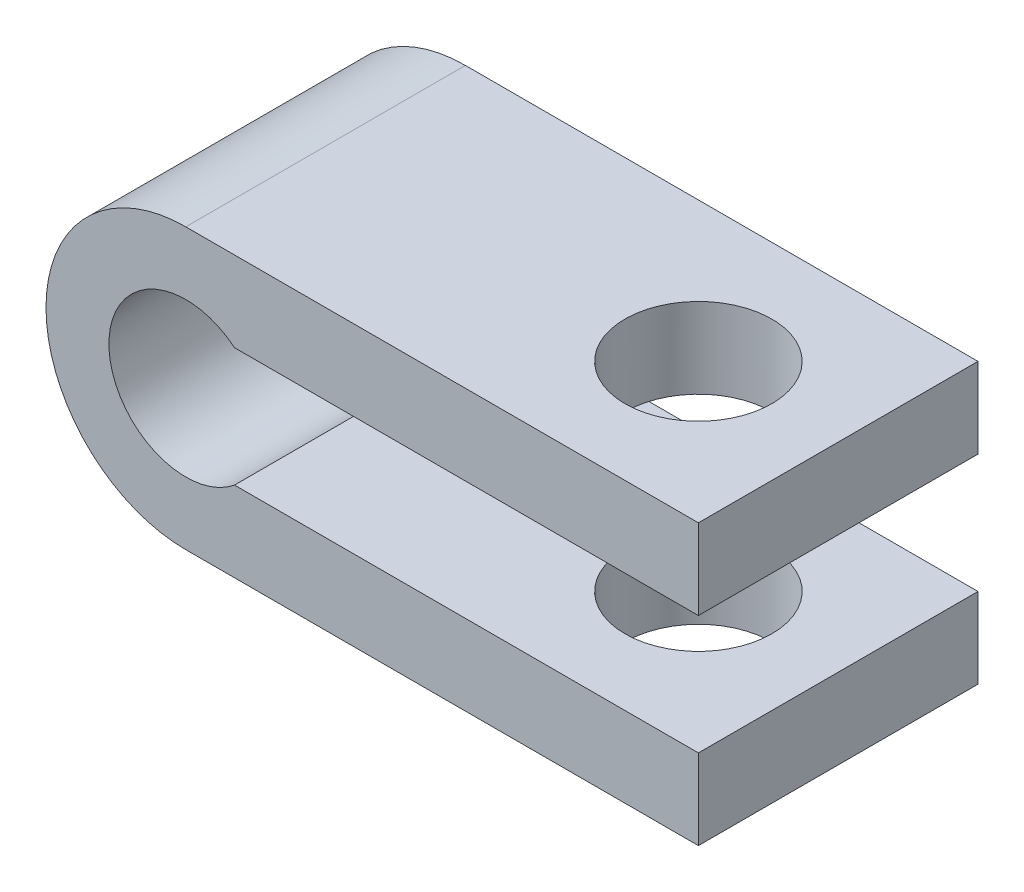
ISO-10303-21;
HEADER;
FILE_DESCRIPTION(('STEP AP214'),'2;1');
FILE_NAME('part.step','',(''),(''),'','','');
FILE_SCHEMA(('AUTOMOTIVE_DESIGN { 1 0 10303 214 1 1 1 1 }'));
ENDSEC;
DATA;
#1=APPLICATION_CONTEXT('core data for automotive mechanical design processes');
#2=APPLICATION_PROTOCOL_DEFINITION('international standard','automotive_design',2000,#1);
#3=PRODUCT_CONTEXT('',#1,'mechanical');
#4=PRODUCT('Part','Part','',(#3));
#5=PRODUCT_RELATED_PRODUCT_CATEGORY('part','',(#4));
#6=PRODUCT_DEFINITION_FORMATION('','',#4);
#7=PRODUCT_DEFINITION_CONTEXT('part definition',#1,'design');
#8=PRODUCT_DEFINITION('design','',#6,#7);
#9=PRODUCT_DEFINITION_SHAPE('','',#8);
#10=(LENGTH_UNIT() NAMED_UNIT(*) SI_UNIT(.MILLI.,.METRE.));
#11=(NAMED_UNIT(*) PLANE_ANGLE_UNIT() SI_UNIT($,.RADIAN.));
#12=(NAMED_UNIT(*) SI_UNIT($,.STERADIAN.) SOLID_ANGLE_UNIT());
#13=UNCERTAINTY_MEASURE_WITH_UNIT(LENGTH_MEASURE(1.E-05),#10,'distance_accuracy_value','');
#14=(GEOMETRIC_REPRESENTATION_CONTEXT(3) GLOBAL_UNCERTAINTY_ASSIGNED_CONTEXT((#13)) GLOBAL_UNIT_ASSIGNED_CONTEXT((#10,
#11,#12)) REPRESENTATION_CONTEXT('',''));
#15=CARTESIAN_POINT('',(0.,0.,0.));
#16=DIRECTION('',(0.,0.,1.));
#17=DIRECTION('',(1.,0.,0.));
#18=AXIS2_PLACEMENT_3D('',#15,#16,#17);
#19=CARTESIAN_POINT('',(0.,0.,12.));
#20=DIRECTION('',(0.,0.,-1.));
#21=DIRECTION('',(-1.,0.,0.));
#22=AXIS2_PLACEMENT_3D('',#19,#20,#21);
#23=CYLINDRICAL_SURFACE('',#22,3.3);
#24=CARTESIAN_POINT('',(0.,0.,0.));
#25=DIRECTION('',(0.,0.,-1.));
#26=DIRECTION('',(1.,0.,0.));
#27=AXIS2_PLACEMENT_3D('',#24,#25,#26);
#28=CIRCLE('',#27,3.3);
#29=CARTESIAN_POINT('',(2.09133180710731,-2.55271057360235,0.));
#30=VERTEX_POINT('',#29);
#31=CARTESIAN_POINT('',(2.09133180710731,2.55271057360235,0.));
#32=VERTEX_POINT('',#31);
#33=EDGE_CURVE('E129',#30,#32,#28,.T.);
#34=ORIENTED_EDGE('',*,*,#33,.T.);
#35=DIRECTION('',(0.,0.,-1.));
#36=VECTOR('',#35,1.);
#37=CARTESIAN_POINT('',(2.09133180710731,2.55271057360235,12.));
#38=LINE('',#37,#36);
#39=CARTESIAN_POINT('',(2.09133180710731,2.55271057360235,12.));
#40=VERTEX_POINT('',#39);
#41=EDGE_CURVE('E11',#40,#32,#38,.T.);
#42=ORIENTED_EDGE('',*,*,#41,.F.);
#43=CARTESIAN_POINT('',(0.,0.,12.));
#44=DIRECTION('',(0.,0.,-1.));
#45=DIRECTION('',(1.,0.,0.));
#46=AXIS2_PLACEMENT_3D('',#43,#44,#45);
#47=CIRCLE('',#46,3.3);
#48=CARTESIAN_POINT('',(2.09133180710731,-2.55271057360235,12.));
#49=VERTEX_POINT('',#48);
#50=EDGE_CURVE('E144',#49,#40,#47,.T.);
#51=ORIENTED_EDGE('',*,*,#50,.F.);
#52=DIRECTION('',(0.,0.,-1.));
#53=VECTOR('',#52,1.);
#54=CARTESIAN_POINT('',(2.09133180710731,-2.55271057360235,12.));
#55=LINE('',#54,#53);
#56=EDGE_CURVE('E125',#49,#30,#55,.T.);
#57=ORIENTED_EDGE('',*,*,#56,.T.);
#58=EDGE_LOOP('',(#34,#42,#51,#57));
#59=FACE_BOUND('',#58,.T.);
#60=ADVANCED_FACE('F32',(#59),#23,.F.);
#61=CARTESIAN_POINT('',(22.,2.55271057360236,12.));
#62=DIRECTION('',(0.,1.,0.));
#63=DIRECTION('',(-1.,0.,0.));
#64=AXIS2_PLACEMENT_3D('',#61,#62,#63);
#65=PLANE('',#64);
#66=CARTESIAN_POINT('',(16.,2.55271057360236,6.));
#67=DIRECTION('',(0.,1.,0.));
#68=DIRECTION('',(-1.,0.,0.));
#69=AXIS2_PLACEMENT_3D('',#66,#67,#68);
#70=CIRCLE('',#69,3.15);
#71=CARTESIAN_POINT('',(12.85,2.55271057360236,6.));
#72=VERTEX_POINT('',#71);
#73=EDGE_CURVE('E133',#72,#72,#70,.T.);
#74=ORIENTED_EDGE('',*,*,#73,.T.);
#75=EDGE_LOOP('',(#74));
#76=FACE_BOUND('',#75,.T.);
#77=DIRECTION('',(1.,0.,0.));
#78=VECTOR('',#77,1.);
#79=CARTESIAN_POINT('',(22.,2.55271057360236,0.));
#80=LINE('',#79,#78);
#81=CARTESIAN_POINT('',(22.,2.55271057360236,0.));
#82=VERTEX_POINT('',#81);
#83=EDGE_CURVE('E132',#32,#82,#80,.T.);
#84=ORIENTED_EDGE('',*,*,#83,.T.);
#85=DIRECTION('',(0.,0.,-1.));
#86=VECTOR('',#85,1.);
#87=CARTESIAN_POINT('',(22.,2.55271057360236,12.));
#88=LINE('',#87,#86);
#89=CARTESIAN_POINT('',(22.,2.55271057360236,12.));
#90=VERTEX_POINT('',#89);
#91=EDGE_CURVE('E41',#90,#82,#88,.T.);
#92=ORIENTED_EDGE('',*,*,#91,.F.);
#93=DIRECTION('',(1.,0.,0.));
#94=VECTOR('',#93,1.);
#95=CARTESIAN_POINT('',(22.,2.55271057360236,12.));
#96=LINE('',#95,#94);
#97=EDGE_CURVE('E92',#40,#90,#96,.T.);
#98=ORIENTED_EDGE('',*,*,#97,.F.);
#99=ORIENTED_EDGE('',*,*,#41,.T.);
#100=EDGE_LOOP('',(#84,#92,#98,#99));
#101=FACE_BOUND('',#100,.T.);
#102=ADVANCED_FACE('F197',(#76,#101),#65,.F.);
#103=CARTESIAN_POINT('',(22.,6.,12.));
#104=DIRECTION('',(-1.,0.,0.));
#105=DIRECTION('',(0.,0.,1.));
#106=AXIS2_PLACEMENT_3D('',#103,#104,#105);
#107=PLANE('',#106);
#108=DIRECTION('',(0.,1.,0.));
#109=VECTOR('',#108,1.);
#110=CARTESIAN_POINT('',(22.,6.,0.));
#111=LINE('',#110,#109);
#112=CARTESIAN_POINT('',(22.,6.,0.));
#113=VERTEX_POINT('',#112);
#114=EDGE_CURVE('E135',#82,#113,#111,.T.);
#115=ORIENTED_EDGE('',*,*,#114,.T.);
#116=DIRECTION('',(0.,0.,-1.));
#117=VECTOR('',#116,1.);
#118=CARTESIAN_POINT('',(22.,6.,12.));
#119=LINE('',#118,#117);
#120=CARTESIAN_POINT('',(22.,6.,12.));
#121=VERTEX_POINT('',#120);
#122=EDGE_CURVE('E151',#121,#113,#119,.T.);
#123=ORIENTED_EDGE('',*,*,#122,.F.);
#124=DIRECTION('',(0.,1.,0.));
#125=VECTOR('',#124,1.);
#126=CARTESIAN_POINT('',(22.,6.,12.));
#127=LINE('',#126,#125);
#128=EDGE_CURVE('E160',#90,#121,#127,.T.);
#129=ORIENTED_EDGE('',*,*,#128,.F.);
#130=ORIENTED_EDGE('',*,*,#91,.T.);
#131=EDGE_LOOP('',(#115,#123,#129,#130));
#132=FACE_BOUND('',#131,.T.);
#133=ADVANCED_FACE('F158',(#132),#107,.F.);
#134=CARTESIAN_POINT('',(0.,6.,12.));
#135=DIRECTION('',(0.,-1.,0.));
#136=DIRECTION('',(0.,0.,-1.));
#137=AXIS2_PLACEMENT_3D('',#134,#135,#136);
#138=PLANE('',#137);
#139=CARTESIAN_POINT('',(16.,6.,6.));
#140=DIRECTION('',(0.,1.,0.));
#141=DIRECTION('',(0.,0.,1.));
#142=AXIS2_PLACEMENT_3D('',#139,#140,#141);
#143=CIRCLE('',#142,3.15);
#144=CARTESIAN_POINT('',(16.,6.,9.15));
#145=VERTEX_POINT('',#144);
#146=EDGE_CURVE('E183',#145,#145,#143,.T.);
#147=ORIENTED_EDGE('',*,*,#146,.F.);
#148=EDGE_LOOP('',(#147));
#149=FACE_BOUND('',#148,.T.);
#150=DIRECTION('',(-1.,0.,0.));
#151=VECTOR('',#150,1.);
#152=CARTESIAN_POINT('',(0.,6.,0.));
#153=LINE('',#152,#151);
#154=CARTESIAN_POINT('',(0.,6.,0.));
#155=VERTEX_POINT('',#154);
#156=EDGE_CURVE('E137',#113,#155,#153,.T.);
#157=ORIENTED_EDGE('',*,*,#156,.T.);
#158=DIRECTION('',(0.,0.,-1.));
#159=VECTOR('',#158,1.);
#160=CARTESIAN_POINT('',(0.,6.,12.));
#161=LINE('',#160,#159);
#162=CARTESIAN_POINT('',(0.,6.,12.));
#163=VERTEX_POINT('',#162);
#164=EDGE_CURVE('E148',#163,#155,#161,.T.);
#165=ORIENTED_EDGE('',*,*,#164,.F.);
#166=DIRECTION('',(-1.,0.,0.));
#167=VECTOR('',#166,1.);
#168=CARTESIAN_POINT('',(0.,6.,12.));
#169=LINE('',#168,#167);
#170=EDGE_CURVE('E172',#121,#163,#169,.T.);
#171=ORIENTED_EDGE('',*,*,#170,.F.);
#172=ORIENTED_EDGE('',*,*,#122,.T.);
#173=EDGE_LOOP('',(#157,#165,#171,#172));
#174=FACE_BOUND('',#173,.T.);
#175=ADVANCED_FACE('F168',(#149,#174),#138,.F.);
#176=CARTESIAN_POINT('',(0.,0.,12.));
#177=DIRECTION('',(0.,0.,-1.));
#178=DIRECTION('',(-1.,0.,0.));
#179=AXIS2_PLACEMENT_3D('',#176,#177,#178);
#180=CYLINDRICAL_SURFACE('',#179,6.);
#181=CARTESIAN_POINT('',(0.,0.,0.));
#182=DIRECTION('',(0.,0.,1.));
#183=DIRECTION('',(1.,0.,0.));
#184=AXIS2_PLACEMENT_3D('',#181,#182,#183);
#185=CIRCLE('',#184,6.);
#186=CARTESIAN_POINT('',(0.,-6.,0.));
#187=VERTEX_POINT('',#186);
#188=EDGE_CURVE('E139',#155,#187,#185,.T.);
#189=ORIENTED_EDGE('',*,*,#188,.T.);
#190=DIRECTION('',(0.,0.,-1.));
#191=VECTOR('',#190,1.);
#192=CARTESIAN_POINT('',(0.,-6.,12.));
#193=LINE('',#192,#191);
#194=CARTESIAN_POINT('',(0.,-6.,12.));
#195=VERTEX_POINT('',#194);
#196=EDGE_CURVE('E120',#195,#187,#193,.T.);
#197=ORIENTED_EDGE('',*,*,#196,.F.);
#198=CARTESIAN_POINT('',(0.,0.,12.));
#199=DIRECTION('',(0.,0.,1.));
#200=DIRECTION('',(1.,0.,0.));
#201=AXIS2_PLACEMENT_3D('',#198,#199,#200);
#202=CIRCLE('',#201,6.);
#203=EDGE_CURVE('E111',#163,#195,#202,.T.);
#204=ORIENTED_EDGE('',*,*,#203,.F.);
#205=ORIENTED_EDGE('',*,*,#164,.T.);
#206=EDGE_LOOP('',(#189,#197,#204,#205));
#207=FACE_BOUND('',#206,.T.);
#208=ADVANCED_FACE('F171',(#207),#180,.T.);
#209=CARTESIAN_POINT('',(0.,-6.,12.));
#210=DIRECTION('',(0.,1.,0.));
#211=DIRECTION('',(0.,0.,1.));
#212=AXIS2_PLACEMENT_3D('',#209,#210,#211);
#213=PLANE('',#212);
#214=CARTESIAN_POINT('',(16.,-6.,6.));
#215=DIRECTION('',(0.,1.,0.));
#216=DIRECTION('',(0.,0.,1.));
#217=AXIS2_PLACEMENT_3D('',#214,#215,#216);
#218=CIRCLE('',#217,3.15);
#219=CARTESIAN_POINT('',(16.,-6.,9.15));
#220=VERTEX_POINT('',#219);
#221=EDGE_CURVE('E180',#220,#220,#218,.T.);
#222=ORIENTED_EDGE('',*,*,#221,.T.);
#223=EDGE_LOOP('',(#222));
#224=FACE_BOUND('',#223,.T.);
#225=DIRECTION('',(1.,0.,0.));
#226=VECTOR('',#225,1.);
#227=CARTESIAN_POINT('',(0.,-6.,0.));
#228=LINE('',#227,#226);
#229=CARTESIAN_POINT('',(22.,-6.,0.));
#230=VERTEX_POINT('',#229);
#231=EDGE_CURVE('E119',#187,#230,#228,.T.);
#232=ORIENTED_EDGE('',*,*,#231,.T.);
#233=DIRECTION('',(0.,0.,-1.));
#234=VECTOR('',#233,1.);
#235=CARTESIAN_POINT('',(22.,-6.,12.));
#236=LINE('',#235,#234);
#237=CARTESIAN_POINT('',(22.,-6.,12.));
#238=VERTEX_POINT('',#237);
#239=EDGE_CURVE('E116',#238,#230,#236,.T.);
#240=ORIENTED_EDGE('',*,*,#239,.F.);
#241=DIRECTION('',(1.,0.,0.));
#242=VECTOR('',#241,1.);
#243=CARTESIAN_POINT('',(0.,-6.,12.));
#244=LINE('',#243,#242);
#245=EDGE_CURVE('E105',#195,#238,#244,.T.);
#246=ORIENTED_EDGE('',*,*,#245,.F.);
#247=ORIENTED_EDGE('',*,*,#196,.T.);
#248=EDGE_LOOP('',(#232,#240,#246,#247));
#249=FACE_BOUND('',#248,.T.);
#250=ADVANCED_FACE('F117',(#224,#249),#213,.F.);
#251=CARTESIAN_POINT('',(22.,-6.,12.));
#252=DIRECTION('',(-1.,0.,0.));
#253=DIRECTION('',(0.,0.,1.));
#254=AXIS2_PLACEMENT_3D('',#251,#252,#253);
#255=PLANE('',#254);
#256=DIRECTION('',(0.,1.,0.));
#257=VECTOR('',#256,1.);
#258=CARTESIAN_POINT('',(22.,-6.,0.));
#259=LINE('',#258,#257);
#260=CARTESIAN_POINT('',(22.,-2.55271057360236,0.));
#261=VERTEX_POINT('',#260);
#262=EDGE_CURVE('E78',#230,#261,#259,.T.);
#263=ORIENTED_EDGE('',*,*,#262,.T.);
#264=DIRECTION('',(0.,0.,-1.));
#265=VECTOR('',#264,1.);
#266=CARTESIAN_POINT('',(22.,-2.55271057360236,12.));
#267=LINE('',#266,#265);
#268=CARTESIAN_POINT('',(22.,-2.55271057360236,12.));
#269=VERTEX_POINT('',#268);
#270=EDGE_CURVE('E121',#269,#261,#267,.T.);
#271=ORIENTED_EDGE('',*,*,#270,.F.);
#272=DIRECTION('',(0.,1.,0.));
#273=VECTOR('',#272,1.);
#274=CARTESIAN_POINT('',(22.,-6.,12.));
#275=LINE('',#274,#273);
#276=EDGE_CURVE('E109',#238,#269,#275,.T.);
#277=ORIENTED_EDGE('',*,*,#276,.F.);
#278=ORIENTED_EDGE('',*,*,#239,.T.);
#279=EDGE_LOOP('',(#263,#271,#277,#278));
#280=FACE_BOUND('',#279,.T.);
#281=ADVANCED_FACE('F123',(#280),#255,.F.);
#282=CARTESIAN_POINT('',(22.,-2.55271057360236,12.));
#283=DIRECTION('',(0.,-1.,0.));
#284=DIRECTION('',(1.,0.,0.));
#285=AXIS2_PLACEMENT_3D('',#282,#283,#284);
#286=PLANE('',#285);
#287=CARTESIAN_POINT('',(16.,-2.55271057360236,6.));
#288=DIRECTION('',(0.,-1.,0.));
#289=DIRECTION('',(1.,0.,0.));
#290=AXIS2_PLACEMENT_3D('',#287,#288,#289);
#291=CIRCLE('',#290,3.15);
#292=CARTESIAN_POINT('',(19.15,-2.55271057360236,6.));
#293=VERTEX_POINT('',#292);
#294=EDGE_CURVE('E35',#293,#293,#291,.T.);
#295=ORIENTED_EDGE('',*,*,#294,.T.);
#296=EDGE_LOOP('',(#295));
#297=FACE_BOUND('',#296,.T.);
#298=DIRECTION('',(-1.,0.,0.));
#299=VECTOR('',#298,1.);
#300=CARTESIAN_POINT('',(22.,-2.55271057360236,0.));
#301=LINE('',#300,#299);
#302=EDGE_CURVE('E84',#261,#30,#301,.T.);
#303=ORIENTED_EDGE('',*,*,#302,.T.);
#304=ORIENTED_EDGE('',*,*,#56,.F.);
#305=DIRECTION('',(-1.,0.,0.));
#306=VECTOR('',#305,1.);
#307=CARTESIAN_POINT('',(22.,-2.55271057360236,12.));
#308=LINE('',#307,#306);
#309=EDGE_CURVE('E49',#269,#49,#308,.T.);
#310=ORIENTED_EDGE('',*,*,#309,.F.);
#311=ORIENTED_EDGE('',*,*,#270,.T.);
#312=EDGE_LOOP('',(#303,#304,#310,#311));
#313=FACE_BOUND('',#312,.T.);
#314=ADVANCED_FACE('F207',(#297,#313),#286,.F.);
#315=CARTESIAN_POINT('',(0.,0.,12.));
#316=DIRECTION('',(0.,0.,1.));
#317=DIRECTION('',(1.,0.,0.));
#318=AXIS2_PLACEMENT_3D('',#315,#316,#317);
#319=PLANE('',#318);
#320=ORIENTED_EDGE('',*,*,#50,.T.);
#321=ORIENTED_EDGE('',*,*,#97,.T.);
#322=ORIENTED_EDGE('',*,*,#128,.T.);
#323=ORIENTED_EDGE('',*,*,#170,.T.);
#324=ORIENTED_EDGE('',*,*,#203,.T.);
#325=ORIENTED_EDGE('',*,*,#245,.T.);
#326=ORIENTED_EDGE('',*,*,#276,.T.);
#327=ORIENTED_EDGE('',*,*,#309,.T.);
#328=EDGE_LOOP('',(#320,#321,#322,#323,#324,#325,#326,#327));
#329=FACE_BOUND('',#328,.T.);
#330=ADVANCED_FACE('F107',(#329),#319,.T.);
#331=CARTESIAN_POINT('',(0.,0.,0.));
#332=DIRECTION('',(0.,0.,1.));
#333=DIRECTION('',(1.,0.,0.));
#334=AXIS2_PLACEMENT_3D('',#331,#332,#333);
#335=PLANE('',#334);
#336=ORIENTED_EDGE('',*,*,#33,.F.);
#337=ORIENTED_EDGE('',*,*,#302,.F.);
#338=ORIENTED_EDGE('',*,*,#262,.F.);
#339=ORIENTED_EDGE('',*,*,#231,.F.);
#340=ORIENTED_EDGE('',*,*,#188,.F.);
#341=ORIENTED_EDGE('',*,*,#156,.F.);
#342=ORIENTED_EDGE('',*,*,#114,.F.);
#343=ORIENTED_EDGE('',*,*,#83,.F.);
#344=EDGE_LOOP('',(#336,#337,#338,#339,#340,#341,#342,#343));
#345=FACE_BOUND('',#344,.T.);
#346=ADVANCED_FACE('F164',(#345),#335,.F.);
#347=CARTESIAN_POINT('',(16.,-6.,6.));
#348=DIRECTION('',(0.,1.,0.));
#349=DIRECTION('',(0.,0.,1.));
#350=AXIS2_PLACEMENT_3D('',#347,#348,#349);
#351=CYLINDRICAL_SURFACE('',#350,3.15);
#352=ORIENTED_EDGE('',*,*,#221,.F.);
#353=EDGE_LOOP('',(#352));
#354=FACE_BOUND('',#353,.T.);
#355=ORIENTED_EDGE('',*,*,#294,.F.);
#356=EDGE_LOOP('',(#355));
#357=FACE_BOUND('',#356,.T.);
#358=ADVANCED_FACE('F226',(#354,#357),#351,.F.);
#359=ORIENTED_EDGE('',*,*,#146,.T.);
#360=EDGE_LOOP('',(#359));
#361=FACE_BOUND('',#360,.T.);
#362=ORIENTED_EDGE('',*,*,#73,.F.);
#363=EDGE_LOOP('',(#362));
#364=FACE_BOUND('',#363,.T.);
#365=ADVANCED_FACE('F187',(#361,#364),#351,.F.);
#366=CLOSED_SHELL('',(#60,#102,#133,#175,#208,#250,#281,#314,#330,#346,#358,#365));
#367=MANIFOLD_SOLID_BREP('B2',#366);
#368=ADVANCED_BREP_SHAPE_REPRESENTATION('',(#18,#367),#14);
#369=SHAPE_DEFINITION_REPRESENTATION(#9,#368);
ENDSEC;
END-ISO-10303-21;
